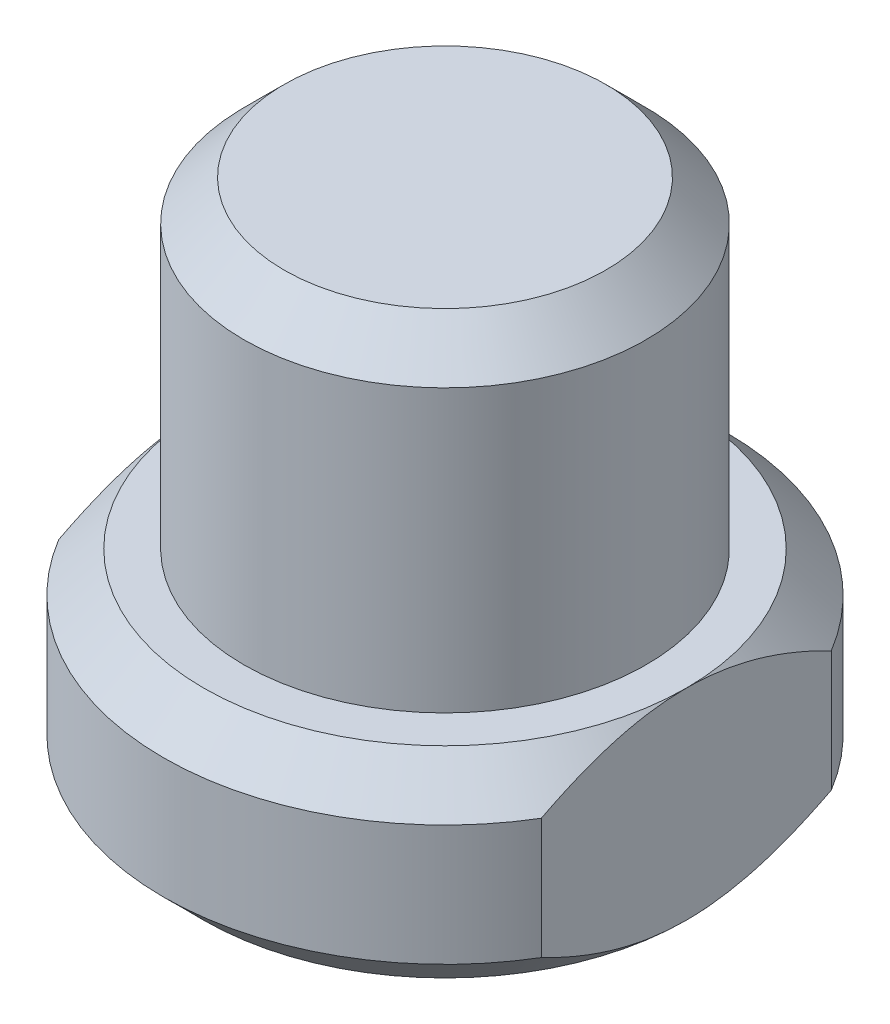
ISO-10303-21;
HEADER;
FILE_DESCRIPTION(('STEP AP214'),'2;1');
FILE_NAME('part.step','',(''),(''),'','','');
FILE_SCHEMA(('AUTOMOTIVE_DESIGN { 1 0 10303 214 1 1 1 1 }'));
ENDSEC;
DATA;
#1=APPLICATION_CONTEXT('core data for automotive mechanical design processes');
#2=APPLICATION_PROTOCOL_DEFINITION('international standard','automotive_design',2000,#1);
#3=PRODUCT_CONTEXT('',#1,'mechanical');
#4=PRODUCT('Part','Part','',(#3));
#5=PRODUCT_RELATED_PRODUCT_CATEGORY('part','',(#4));
#6=PRODUCT_DEFINITION_FORMATION('','',#4);
#7=PRODUCT_DEFINITION_CONTEXT('part definition',#1,'design');
#8=PRODUCT_DEFINITION('design','',#6,#7);
#9=PRODUCT_DEFINITION_SHAPE('','',#8);
#10=(LENGTH_UNIT() NAMED_UNIT(*) SI_UNIT(.MILLI.,.METRE.));
#11=(NAMED_UNIT(*) PLANE_ANGLE_UNIT() SI_UNIT($,.RADIAN.));
#12=(NAMED_UNIT(*) SI_UNIT($,.STERADIAN.) SOLID_ANGLE_UNIT());
#13=UNCERTAINTY_MEASURE_WITH_UNIT(LENGTH_MEASURE(1.E-05),#10,'distance_accuracy_value','');
#14=(GEOMETRIC_REPRESENTATION_CONTEXT(3) GLOBAL_UNCERTAINTY_ASSIGNED_CONTEXT((#13)) GLOBAL_UNIT_ASSIGNED_CONTEXT((#10,
#11,#12)) REPRESENTATION_CONTEXT('',''));
#15=CARTESIAN_POINT('',(0.,0.,0.));
#16=DIRECTION('',(0.,0.,1.));
#17=DIRECTION('',(1.,0.,0.));
#18=AXIS2_PLACEMENT_3D('',#15,#16,#17);
#19=CARTESIAN_POINT('',(0.,0.,0.));
#20=DIRECTION('',(0.,1.,0.));
#21=DIRECTION('',(0.,0.,1.));
#22=AXIS2_PLACEMENT_3D('',#19,#20,#21);
#23=CYLINDRICAL_SURFACE('',#22,7.);
#24=CARTESIAN_POINT('',(0.,1.00000000000033,0.));
#25=DIRECTION('',(0.,1.,0.));
#26=DIRECTION('',(0.,0.,1.));
#27=AXIS2_PLACEMENT_3D('',#24,#25,#26);
#28=CIRCLE('',#27,7.);
#29=CARTESIAN_POINT('',(6.00000000000001,1.00000000000033,-3.605551275464));
#30=VERTEX_POINT('',#29);
#31=CARTESIAN_POINT('',(-6.00000000000001,1.00000000000033,-3.60555127546402));
#32=VERTEX_POINT('',#31);
#33=EDGE_CURVE('E160',#30,#32,#28,.T.);
#34=ORIENTED_EDGE('',*,*,#33,.T.);
#35=DIRECTION('',(0.,1.,0.));
#36=VECTOR('',#35,1.);
#37=CARTESIAN_POINT('',(-6.00000000000001,0.,-3.60555127546402));
#38=LINE('',#37,#36);
#39=CARTESIAN_POINT('',(-6.00000000000001,3.99999999999956,-3.60555127546402));
#40=VERTEX_POINT('',#39);
#41=EDGE_CURVE('E64',#32,#40,#38,.T.);
#42=ORIENTED_EDGE('',*,*,#41,.T.);
#43=CARTESIAN_POINT('',(0.,3.99999999999956,0.));
#44=DIRECTION('',(0.,1.,0.));
#45=DIRECTION('',(0.,0.,1.));
#46=AXIS2_PLACEMENT_3D('',#43,#44,#45);
#47=CIRCLE('',#46,7.);
#48=CARTESIAN_POINT('',(6.00000000000001,3.99999999999956,-3.60555127546403));
#49=VERTEX_POINT('',#48);
#50=EDGE_CURVE('E119',#49,#40,#47,.T.);
#51=ORIENTED_EDGE('',*,*,#50,.F.);
#52=DIRECTION('',(0.,1.,0.));
#53=VECTOR('',#52,1.);
#54=CARTESIAN_POINT('',(6.00000000000001,0.,-3.605551275464));
#55=LINE('',#54,#53);
#56=EDGE_CURVE('E120',#49,#30,#55,.F.);
#57=ORIENTED_EDGE('',*,*,#56,.T.);
#58=EDGE_LOOP('',(#34,#42,#51,#57));
#59=FACE_BOUND('',#58,.T.);
#60=ADVANCED_FACE('F44',(#59),#23,.T.);
#61=CARTESIAN_POINT('',(0.,3.99999999999956,0.));
#62=DIRECTION('',(0.,-1.,0.));
#63=DIRECTION('',(0.,0.,-1.));
#64=AXIS2_PLACEMENT_3D('',#61,#62,#63);
#65=CONICAL_SURFACE('',#64,7.,0.785398163397449);
#66=ORIENTED_EDGE('',*,*,#50,.T.);
#67=CARTESIAN_POINT('',(-6.00000000000001,-2.02979677514836,-11.5661404107707));
#68=CARTESIAN_POINT('',(-6.00000000000001,-1.79146881079267,-11.2976097905496));
#69=CARTESIAN_POINT('',(-6.00000000000001,-1.55408028847918,-11.028237253114));
#70=CARTESIAN_POINT('',(-6.00000000000001,-1.0816851461887,-10.4873603134305));
#71=CARTESIAN_POINT('',(-6.00000000000001,-0.846678793290499,-10.2158556780665));
#72=CARTESIAN_POINT('',(-6.00000000000001,-0.378542744139718,-9.669086248888));
#73=CARTESIAN_POINT('',(-6.00000000000001,-0.145426430687708,-9.39380997399726));
#74=CARTESIAN_POINT('',(-6.00000000000001,0.317065428672959,-8.84015130816264));
#75=CARTESIAN_POINT('',(-6.00000000000001,0.54644116299968,-8.56176907486716));
#76=CARTESIAN_POINT('',(-6.00000000000001,1.01436311140784,-7.98395030269193));
#77=CARTESIAN_POINT('',(-6.00000000000001,1.25260896674657,-7.68426961361499));
#78=CARTESIAN_POINT('',(-6.00000000000001,1.72203804498399,-7.07933619039574));
#79=CARTESIAN_POINT('',(-6.00000000000001,1.95322017653144,-6.77408260675885));
#80=CARTESIAN_POINT('',(-6.00000000000001,2.40552041325527,-6.15704391578297));
#81=CARTESIAN_POINT('',(-6.00000000000001,2.62665710380914,-5.84527257060795));
#82=CARTESIAN_POINT('',(-6.00000000000001,2.94817866705449,-5.37077710084772));
#83=CARTESIAN_POINT('',(-6.00000000000001,3.05364222446894,-5.21149335809911));
#84=CARTESIAN_POINT('',(-6.00000000000001,3.26049287379129,-4.89030636823462));
#85=CARTESIAN_POINT('',(-6.,3.3618802875576,-4.72840332936365));
#86=CARTESIAN_POINT('',(-6.00000000000001,3.52899645380357,-4.45240542180068));
#87=CARTESIAN_POINT('',(-6.00000000000001,3.59601398214699,-4.33909155098068));
#88=CARTESIAN_POINT('',(-6.00000000000001,3.72737764928734,-4.11092816525281));
#89=CARTESIAN_POINT('',(-6.00000000000001,3.79172378021098,-3.99607864582031));
#90=CARTESIAN_POINT('',(-6.00000000000001,3.98023784286186,-3.64895878647408));
#91=CARTESIAN_POINT('',(-6.00000000000001,4.09984954803733,-3.4141691477967));
#92=CARTESIAN_POINT('',(-6.00000000000001,4.32206684441624,-2.93912591263695));
#93=CARTESIAN_POINT('',(-6.00000000000001,4.42481339317554,-2.6989389463608));
#94=CARTESIAN_POINT('',(-6.00000000000001,4.60966523657402,-2.21071934903159));
#95=CARTESIAN_POINT('',(-6.00000000000001,4.69178312635193,-1.96269160995187));
#96=CARTESIAN_POINT('',(-6.00000000000001,4.80860857580128,-1.53669838829372));
#97=CARTESIAN_POINT('',(-6.00000000000001,4.85013138960785,-1.3606052930844));
#98=CARTESIAN_POINT('',(-6.00000000000001,4.91880051242658,-1.00562099164745));
#99=CARTESIAN_POINT('',(-6.00000000000001,4.94594934997519,-0.826730283253964));
#100=CARTESIAN_POINT('',(-6.00000000000001,4.98442565295902,-0.467815198481911));
#101=CARTESIAN_POINT('',(-6.00000000000001,4.99580385136223,-0.287796337501631));
#102=CARTESIAN_POINT('',(-6.00000000000001,5.00226570099365,0.0725419067335196));
#103=CARTESIAN_POINT('',(-6.00000000000001,4.99734912860882,0.25286129407857));
#104=CARTESIAN_POINT('',(-6.00000000000001,4.97157394731632,0.611322010479733));
#105=CARTESIAN_POINT('',(-6.00000000000001,4.95080478624151,0.789469882026787));
#106=CARTESIAN_POINT('',(-6.00000000000001,4.8945211690532,1.14342979147521));
#107=CARTESIAN_POINT('',(-6.00000000000001,4.85900314884088,1.3192412541725));
#108=CARTESIAN_POINT('',(-6.00000000000001,4.77438636740441,1.66958106357355));
#109=CARTESIAN_POINT('',(-6.00000000000001,4.72514199578012,1.84407381326022));
#110=CARTESIAN_POINT('',(-6.00000000000001,4.61515026533972,2.18931186925035));
#111=CARTESIAN_POINT('',(-6.00000000000001,4.55440512044053,2.36005788975738));
#112=CARTESIAN_POINT('',(-6.00000000000001,4.39892342784069,2.76039026044567));
#113=CARTESIAN_POINT('',(-6.00000000000001,4.29993482554905,2.98831860725602));
#114=CARTESIAN_POINT('',(-6.00000000000001,4.08786273758492,3.43757084246485));
#115=CARTESIAN_POINT('',(-6.00000000000001,3.97477122653467,3.65889088075212));
#116=CARTESIAN_POINT('',(-6.00000000000001,3.73730564329471,4.09641361162926));
#117=CARTESIAN_POINT('',(-6.00000000000001,3.61289111438914,4.31259417219535));
#118=CARTESIAN_POINT('',(-6.00000000000001,3.35562605089439,4.73977989309806));
#119=CARTESIAN_POINT('',(-6.00000000000001,3.22277722815056,4.95078609166065));
#120=CARTESIAN_POINT('',(-6.00000000000001,2.9573595332018,5.35785781684801));
#121=CARTESIAN_POINT('',(-6.00000000000001,2.82511846854011,5.55413819422643));
#122=CARTESIAN_POINT('',(-6.00000000000001,2.55582573120988,5.94338396040382));
#123=CARTESIAN_POINT('',(-6.00000000000001,2.41877366800638,6.13634907818258));
#124=CARTESIAN_POINT('',(-6.00000000000001,2.14202520896178,6.51773076015835));
#125=CARTESIAN_POINT('',(-6.00000000000001,2.00236350909527,6.70617258784602));
#126=CARTESIAN_POINT('',(-6.00000000000001,1.71990341155048,7.0806155317909));
#127=CARTESIAN_POINT('',(-6.00000000000001,1.57710584778785,7.26661727641308));
#128=CARTESIAN_POINT('',(-6.00000000000001,1.43304522414578,7.45161886325634));
#129=B_SPLINE_CURVE_WITH_KNOTS('',3,(#67,#68,#69,#70,#71,#72,#73,#74,#75,#76,#77,#78,#79,#80,
#81,#82,#83,#84,#85,#86,#87,#88,#89,#90,#91,#92,#93,#94,#95,#96,#97,#98,#99,#100,#101,#102,#103,
#104,#105,#106,#107,#108,#109,#110,#111,#112,#113,#114,#115,#116,#117,#118,#119,#120,#121,#122,
#123,#124,#125,#126,#127,#128),.UNSPECIFIED.,.F.,.F.,(4,2,2,2,2,2,2,2,2,2,2,2,2,2,2,2,2,2,2,2,2,
2,2,2,2,2,2,2,2,2,4),(0.,1.07712344820326,2.15436635214866,3.23650502013409,4.31858900989687,
5.46703820996629,6.6156639582858,7.76206998619451,8.33512399248531,8.90813266034527,
9.30304494578501,9.69795839504988,10.4879681133811,11.2709957035387,12.0535440359906,
12.5958011820691,13.1379629075858,13.6783764592678,14.2187974270726,14.7561914211106,
15.2937153533988,15.8371738864698,16.3805279090948,17.1253550100298,17.8706079119149,
18.6186367660037,19.3665142806594,20.0764452484526,20.7864339790826,21.4900612113484,
22.1935035422391),.UNSPECIFIED.);
#130=CARTESIAN_POINT('',(-6.00000000000001,4.99999999999989,0.));
#131=VERTEX_POINT('',#130);
#132=EDGE_CURVE('E105',#40,#131,#129,.T.);
#133=ORIENTED_EDGE('',*,*,#132,.T.);
#134=CARTESIAN_POINT('',(0.,4.99999999999989,0.));
#135=DIRECTION('',(0.,1.,0.));
#136=DIRECTION('',(0.,0.,1.));
#137=AXIS2_PLACEMENT_3D('',#134,#135,#136);
#138=CIRCLE('',#137,6.);
#139=CARTESIAN_POINT('',(6.00000000000001,4.99999999999989,0.));
#140=VERTEX_POINT('',#139);
#141=EDGE_CURVE('E117',#140,#131,#138,.T.);
#142=ORIENTED_EDGE('',*,*,#141,.F.);
#143=CARTESIAN_POINT('',(6.00000000000001,-2.02979677514836,-11.5661404107707));
#144=CARTESIAN_POINT('',(6.00000000000001,-1.79146881079267,-11.2976097905496));
#145=CARTESIAN_POINT('',(6.00000000000001,-1.55408028847917,-11.028237253114));
#146=CARTESIAN_POINT('',(6.00000000000001,-1.08168514618869,-10.4873603134305));
#147=CARTESIAN_POINT('',(6.00000000000001,-0.846678793290494,-10.2158556780665));
#148=CARTESIAN_POINT('',(6.00000000000001,-0.378542744139714,-9.66908624888799));
#149=CARTESIAN_POINT('',(6.,-0.145426430687703,-9.39380997399725));
#150=CARTESIAN_POINT('',(6.,0.317065428672965,-8.84015130816264));
#151=CARTESIAN_POINT('',(6.,0.546441162999685,-8.56176907486716));
#152=CARTESIAN_POINT('',(6.,1.01436311140785,-7.98395030269192));
#153=CARTESIAN_POINT('',(6.,1.25260896674658,-7.68426961361498));
#154=CARTESIAN_POINT('',(6.,1.722038044984,-7.07933619039573));
#155=CARTESIAN_POINT('',(6.,1.95322017653145,-6.77408260675884));
#156=CARTESIAN_POINT('',(6.,2.40552041325527,-6.15704391578296));
#157=CARTESIAN_POINT('',(6.,2.62665710380914,-5.84527257060793));
#158=CARTESIAN_POINT('',(6.,2.9481786670545,-5.37077710084771));
#159=CARTESIAN_POINT('',(6.,3.05364222446895,-5.21149335809909));
#160=CARTESIAN_POINT('',(6.,3.2604928737913,-4.8903063682346));
#161=CARTESIAN_POINT('',(6.00000000000001,3.3618802875576,-4.72840332936363));
#162=CARTESIAN_POINT('',(6.00000000000001,3.52899645380357,-4.45240542180065));
#163=CARTESIAN_POINT('',(6.,3.596013982147,-4.33909155098066));
#164=CARTESIAN_POINT('',(6.,3.72737764928736,-4.1109281652528));
#165=CARTESIAN_POINT('',(6.,3.79172378021099,-3.99607864582029));
#166=CARTESIAN_POINT('',(6.,3.98023784286187,-3.64895878647407));
#167=CARTESIAN_POINT('',(6.,4.09984954803734,-3.41416914779669));
#168=CARTESIAN_POINT('',(6.,4.32206684441625,-2.93912591263694));
#169=CARTESIAN_POINT('',(6.,4.42481339317554,-2.69893894636079));
#170=CARTESIAN_POINT('',(6.,4.60966523657402,-2.21071934903158));
#171=CARTESIAN_POINT('',(6.00000000000001,4.69178312635193,-1.96269160995187));
#172=CARTESIAN_POINT('',(6.,4.80860857580128,-1.53669838829372));
#173=CARTESIAN_POINT('',(6.,4.85013138960785,-1.3606052930844));
#174=CARTESIAN_POINT('',(6.,4.91880051242659,-1.00562099164745));
#175=CARTESIAN_POINT('',(6.,4.94594934997519,-0.826730283253965));
#176=CARTESIAN_POINT('',(6.,4.98442565295903,-0.467815198481911));
#177=CARTESIAN_POINT('',(6.,4.99580385136224,-0.287796337501631));
#178=CARTESIAN_POINT('',(6.,5.00226570099366,0.0725419067335198));
#179=CARTESIAN_POINT('',(6.00000000000001,4.99734912860882,0.252861294078571));
#180=CARTESIAN_POINT('',(6.00000000000001,4.97157394731632,0.611322010479731));
#181=CARTESIAN_POINT('',(6.,4.95080478624151,0.789469882026785));
#182=CARTESIAN_POINT('',(6.,4.89452116905321,1.14342979147521));
#183=CARTESIAN_POINT('',(6.,4.85900314884089,1.3192412541725));
#184=CARTESIAN_POINT('',(6.,4.77438636740442,1.66958106357355));
#185=CARTESIAN_POINT('',(6.,4.72514199578012,1.84407381326022));
#186=CARTESIAN_POINT('',(6.,4.61515026533972,2.18931186925035));
#187=CARTESIAN_POINT('',(6.00000000000001,4.55440512044053,2.36005788975737));
#188=CARTESIAN_POINT('',(6.00000000000001,4.39892342784069,2.76039026044566));
#189=CARTESIAN_POINT('',(6.,4.29993482554906,2.98831860725601));
#190=CARTESIAN_POINT('',(6.,4.08786273758493,3.43757084246485));
#191=CARTESIAN_POINT('',(6.,3.97477122653467,3.65889088075212));
#192=CARTESIAN_POINT('',(6.,3.73730564329471,4.09641361162926));
#193=CARTESIAN_POINT('',(6.,3.61289111438914,4.31259417219535));
#194=CARTESIAN_POINT('',(6.,3.35562605089439,4.73977989309806));
#195=CARTESIAN_POINT('',(6.,3.22277722815056,4.95078609166065));
#196=CARTESIAN_POINT('',(6.,2.9573595332018,5.35785781684801));
#197=CARTESIAN_POINT('',(6.,2.82511846854012,5.55413819422644));
#198=CARTESIAN_POINT('',(6.,2.55582573120988,5.94338396040382));
#199=CARTESIAN_POINT('',(6.,2.41877366800638,6.13634907818258));
#200=CARTESIAN_POINT('',(6.,2.14202520896178,6.51773076015835));
#201=CARTESIAN_POINT('',(6.,2.00236350909528,6.70617258784602));
#202=CARTESIAN_POINT('',(6.,1.71990341155049,7.0806155317909));
#203=CARTESIAN_POINT('',(6.,1.57710584778785,7.26661727641308));
#204=CARTESIAN_POINT('',(6.00000000000001,1.43304522414578,7.45161886325634));
#205=B_SPLINE_CURVE_WITH_KNOTS('',3,(#143,#144,#145,#146,#147,#148,#149,#150,#151,#152,#153,
#154,#155,#156,#157,#158,#159,#160,#161,#162,#163,#164,#165,#166,#167,#168,#169,#170,#171,#172,
#173,#174,#175,#176,#177,#178,#179,#180,#181,#182,#183,#184,#185,#186,#187,#188,#189,#190,#191,
#192,#193,#194,#195,#196,#197,#198,#199,#200,#201,#202,#203,#204),.UNSPECIFIED.,.F.,.F.,(4,2,2,
2,2,2,2,2,2,2,2,2,2,2,2,2,2,2,2,2,2,2,2,2,2,2,2,2,2,2,4),(0.,1.07712344820326,2.15436635214867,
3.23650502013409,4.31858900989687,5.4670382099663,6.61566395828581,7.76206998619452,
8.33512399248533,8.90813266034529,9.30304494578503,9.6979583950499,10.4879681133811,
11.2709957035387,12.0535440359906,12.5958011820691,13.1379629075858,13.6783764592678,
14.2187974270726,14.7561914211106,15.2937153533988,15.8371738864698,16.3805279090948,
17.1253550100298,17.8706079119149,18.6186367660037,19.3665142806594,20.0764452484526,
20.7864339790826,21.4900612113484,22.1935035422391),.UNSPECIFIED.);
#206=EDGE_CURVE('E152',#140,#49,#205,.F.);
#207=ORIENTED_EDGE('',*,*,#206,.T.);
#208=EDGE_LOOP('',(#66,#133,#142,#207));
#209=FACE_BOUND('',#208,.T.);
#210=ADVANCED_FACE('F114',(#209),#65,.T.);
#211=CARTESIAN_POINT('',(0.,0.,0.));
#212=DIRECTION('',(0.,1.,0.));
#213=DIRECTION('',(0.,0.,1.));
#214=AXIS2_PLACEMENT_3D('',#211,#212,#213);
#215=CONICAL_SURFACE('',#214,5.99999999999998,0.78539816339746);
#216=CARTESIAN_POINT('',(-6.00000000000001,1.00000000000033,3.60555127546396));
#217=VERTEX_POINT('',#216);
#218=CARTESIAN_POINT('',(6.00000000000001,1.00000000000033,3.60555127546399));
#219=VERTEX_POINT('',#218);
#220=EDGE_CURVE('E72',#217,#219,#28,.T.);
#221=ORIENTED_EDGE('',*,*,#220,.F.);
#222=CARTESIAN_POINT('',(-6.00000000000001,7.02979677514826,-11.5661404107708));
#223=CARTESIAN_POINT('',(-6.00000000000001,6.79146881079234,-11.2976097905497));
#224=CARTESIAN_POINT('',(-6.00000000000001,6.55408028847871,-11.0282372531141));
#225=CARTESIAN_POINT('',(-6.00000000000001,6.08168514618804,-10.4873603134305));
#226=CARTESIAN_POINT('',(-6.00000000000001,5.84667879328979,-10.2158556780663));
#227=CARTESIAN_POINT('',(-6.00000000000001,5.37854274413892,-9.66908624888768));
#228=CARTESIAN_POINT('',(-6.00000000000001,5.14542643068686,-9.39380997399689));
#229=CARTESIAN_POINT('',(-6.00000000000001,4.68293457132612,-8.84015130816216));
#230=CARTESIAN_POINT('',(-6.00000000000001,4.45355883699936,-8.56176907486662));
#231=CARTESIAN_POINT('',(-6.00000000000001,3.98563688859123,-7.9839503026914));
#232=CARTESIAN_POINT('',(-6.00000000000001,3.74739103325257,-7.68426961361453));
#233=CARTESIAN_POINT('',(-6.00000000000001,3.27796195501528,-7.07933619039544));
#234=CARTESIAN_POINT('',(-6.00000000000001,3.0467798234679,-6.77408260675864));
#235=CARTESIAN_POINT('',(-6.00000000000001,2.59447958674421,-6.15704391578288));
#236=CARTESIAN_POINT('',(-6.00000000000001,2.37334289619043,-5.84527257060788));
#237=CARTESIAN_POINT('',(-6.00000000000001,2.05182133294505,-5.37077710084779));
#238=CARTESIAN_POINT('',(-6.00000000000001,1.94635777553057,-5.21149335809923));
#239=CARTESIAN_POINT('',(-6.00000000000001,1.73950712620841,-4.8903063682347));
#240=CARTESIAN_POINT('',(-6.,1.63811971244233,-4.72840332936362));
#241=CARTESIAN_POINT('',(-6.00000000000001,1.4710035461963,-4.45240542180072));
#242=CARTESIAN_POINT('',(-6.00000000000001,1.40398601785272,-4.33909155098082));
#243=CARTESIAN_POINT('',(-6.00000000000001,1.27262235071226,-4.11092816525304));
#244=CARTESIAN_POINT('',(-6.00000000000001,1.20827621978866,-3.99607864582053));
#245=CARTESIAN_POINT('',(-6.00000000000001,1.0197621571379,-3.64895878647431));
#246=CARTESIAN_POINT('',(-6.00000000000001,0.900150451962495,-3.41416914779698));
#247=CARTESIAN_POINT('',(-6.00000000000001,0.677933155583385,-2.93912591263736));
#248=CARTESIAN_POINT('',(-6.00000000000001,0.575186606823834,-2.6989389463613));
#249=CARTESIAN_POINT('',(-6.00000000000001,0.390334763426047,-2.21071934903187));
#250=CARTESIAN_POINT('',(-6.00000000000001,0.30821687364909,-1.96269160995183));
#251=CARTESIAN_POINT('',(-6.00000000000001,0.191391424199329,-1.53669838829366));
#252=CARTESIAN_POINT('',(-6.00000000000001,0.149868610392018,-1.36060529308447));
#253=CARTESIAN_POINT('',(-6.00000000000001,0.0811994875727461,-1.00562099164758));
#254=CARTESIAN_POINT('',(-6.00000000000001,0.0540506500243481,-0.826730283254024));
#255=CARTESIAN_POINT('',(-6.00000000000001,0.0155743470406083,-0.467815198481907));
#256=CARTESIAN_POINT('',(-6.00000000000001,0.00419614863728724,-0.287796337501633));
#257=CARTESIAN_POINT('',(-6.00000000000001,-0.0022657009940103,0.0725419067335352));
#258=CARTESIAN_POINT('',(-6.00000000000001,0.00265087139106523,0.252861294078609));
#259=CARTESIAN_POINT('',(-6.00000000000001,0.0284260526835789,0.611322010479821));
#260=CARTESIAN_POINT('',(-6.00000000000001,0.0491952137581669,0.789469882026902));
#261=CARTESIAN_POINT('',(-6.00000000000001,0.10547883094632,1.14342979147534));
#262=CARTESIAN_POINT('',(-6.00000000000001,0.140996851158716,1.31924125417261));
#263=CARTESIAN_POINT('',(-6.00000000000001,0.225613632595204,1.66958106357367));
#264=CARTESIAN_POINT('',(-6.00000000000001,0.274858004219446,1.84407381326037));
#265=CARTESIAN_POINT('',(-6.00000000000001,0.384849734659961,2.18931186925049));
#266=CARTESIAN_POINT('',(-6.00000000000001,0.445594879559324,2.36005788975748));
#267=CARTESIAN_POINT('',(-6.00000000000001,0.601076572159278,2.76039026044583));
#268=CARTESIAN_POINT('',(-6.00000000000001,0.700065174450738,2.98831860725633));
#269=CARTESIAN_POINT('',(-6.00000000000001,0.912137262414791,3.43757084246534));
#270=CARTESIAN_POINT('',(-6.00000000000001,1.02522877346513,3.65889088075263));
#271=CARTESIAN_POINT('',(-6.00000000000001,1.2626943567052,4.09641361162985));
#272=CARTESIAN_POINT('',(-6.00000000000001,1.38710888561078,4.31259417219597));
#273=CARTESIAN_POINT('',(-6.00000000000001,1.64437394910559,4.73977989309875));
#274=CARTESIAN_POINT('',(-6.00000000000001,1.77722277184945,4.95078609166138));
#275=CARTESIAN_POINT('',(-6.00000000000001,2.04264046679823,5.35785781684874));
#276=CARTESIAN_POINT('',(-6.00000000000001,2.1748815314599,5.55413819422713));
#277=CARTESIAN_POINT('',(-6.00000000000001,2.44417426879009,5.94338396040444));
#278=CARTESIAN_POINT('',(-6.00000000000001,2.58122633199357,6.13634907818317));
#279=CARTESIAN_POINT('',(-6.00000000000001,2.85797479103814,6.51773076015888));
#280=CARTESIAN_POINT('',(-6.00000000000001,2.99763649090464,6.70617258784654));
#281=CARTESIAN_POINT('',(-6.00000000000001,3.28009658844941,7.0806155317914));
#282=CARTESIAN_POINT('',(-6.00000000000001,3.42289415221204,7.26661727641357));
#283=CARTESIAN_POINT('',(-6.00000000000001,3.56695477585411,7.45161886325681));
#284=B_SPLINE_CURVE_WITH_KNOTS('',3,(#222,#223,#224,#225,#226,#227,#228,#229,#230,#231,#232,
#233,#234,#235,#236,#237,#238,#239,#240,#241,#242,#243,#244,#245,#246,#247,#248,#249,#250,#251,
#252,#253,#254,#255,#256,#257,#258,#259,#260,#261,#262,#263,#264,#265,#266,#267,#268,#269,#270,
#271,#272,#273,#274,#275,#276,#277,#278,#279,#280,#281,#282,#283),.UNSPECIFIED.,.F.,.F.,(4,2,2,
2,2,2,2,2,2,2,2,2,2,2,2,2,2,2,2,2,2,2,2,2,2,2,2,2,2,2,4),(0.,1.0771234482036,2.15436635214933,
3.23650502013496,4.31858900989795,5.46703820996707,6.61566395828626,7.76206998619475,
8.33512399248546,8.90813266034535,9.30304494578506,9.69795839504989,10.487968113381,
11.2709957035385,12.0535440359905,12.5958011820691,13.1379629075859,13.6783764592679,
14.2187974270728,14.7561914211109,15.293715353399,15.8371738864701,16.3805279090951,
17.1253550100303,17.8706079119157,18.6186367660045,19.3665142806604,20.0764452484535,
20.7864339790833,21.4900612113491,22.1935035422397),.UNSPECIFIED.);
#285=CARTESIAN_POINT('',(-6.00000000000001,-8.88178419700125E-13,0.));
#286=VERTEX_POINT('',#285);
#287=EDGE_CURVE('E12',#217,#286,#284,.F.);
#288=ORIENTED_EDGE('',*,*,#287,.T.);
#289=CARTESIAN_POINT('',(0.,0.,0.));
#290=DIRECTION('',(0.,1.,0.));
#291=DIRECTION('',(0.,0.,1.));
#292=AXIS2_PLACEMENT_3D('',#289,#290,#291);
#293=CIRCLE('',#292,5.99999999999998);
#294=CARTESIAN_POINT('',(6.00000000000001,-8.88178419700125E-13,0.));
#295=VERTEX_POINT('',#294);
#296=EDGE_CURVE('E181',#286,#295,#293,.T.);
#297=ORIENTED_EDGE('',*,*,#296,.T.);
#298=CARTESIAN_POINT('',(6.00000000000001,7.02979677514826,-11.5661404107708));
#299=CARTESIAN_POINT('',(6.00000000000001,6.79146881079234,-11.2976097905497));
#300=CARTESIAN_POINT('',(6.00000000000001,6.55408028847871,-11.0282372531141));
#301=CARTESIAN_POINT('',(6.00000000000001,6.08168514618804,-10.4873603134305));
#302=CARTESIAN_POINT('',(6.,5.84667879328979,-10.2158556780663));
#303=CARTESIAN_POINT('',(6.,5.37854274413891,-9.66908624888767));
#304=CARTESIAN_POINT('',(6.,5.14542643068686,-9.39380997399688));
#305=CARTESIAN_POINT('',(6.,4.68293457132611,-8.84015130816215));
#306=CARTESIAN_POINT('',(6.,4.45355883699935,-8.56176907486661));
#307=CARTESIAN_POINT('',(6.,3.98563688859122,-7.98395030269139));
#308=CARTESIAN_POINT('',(6.,3.74739103325256,-7.68426961361452));
#309=CARTESIAN_POINT('',(6.,3.27796195501527,-7.07933619039543));
#310=CARTESIAN_POINT('',(6.,3.04677982346789,-6.77408260675863));
#311=CARTESIAN_POINT('',(6.,2.5944795867442,-6.15704391578286));
#312=CARTESIAN_POINT('',(6.,2.37334289619042,-5.84527257060787));
#313=CARTESIAN_POINT('',(6.,2.05182133294504,-5.37077710084778));
#314=CARTESIAN_POINT('',(6.,1.94635777553055,-5.21149335809922));
#315=CARTESIAN_POINT('',(6.,1.7395071262084,-4.89030636823467));
#316=CARTESIAN_POINT('',(6.00000000000001,1.63811971244233,-4.72840332936359));
#317=CARTESIAN_POINT('',(6.00000000000001,1.4710035461963,-4.45240542180069));
#318=CARTESIAN_POINT('',(6.,1.40398601785271,-4.3390915509808));
#319=CARTESIAN_POINT('',(6.,1.27262235071224,-4.11092816525302));
#320=CARTESIAN_POINT('',(6.,1.20827621978865,-3.99607864582051));
#321=CARTESIAN_POINT('',(6.,1.01976215713789,-3.64895878647429));
#322=CARTESIAN_POINT('',(6.,0.900150451962483,-3.41416914779696));
#323=CARTESIAN_POINT('',(6.,0.677933155583372,-2.93912591263734));
#324=CARTESIAN_POINT('',(6.,0.575186606823821,-2.69893894636129));
#325=CARTESIAN_POINT('',(6.,0.390334763426041,-2.21071934903185));
#326=CARTESIAN_POINT('',(6.00000000000001,0.308216873649092,-1.96269160995181));
#327=CARTESIAN_POINT('',(6.,0.191391424199328,-1.53669838829364));
#328=CARTESIAN_POINT('',(6.,0.149868610392012,-1.36060529308445));
#329=CARTESIAN_POINT('',(6.,0.0811994875727371,-1.00562099164756));
#330=CARTESIAN_POINT('',(6.,0.0540506500243413,-0.826730283254005));
#331=CARTESIAN_POINT('',(6.,0.0155743470406027,-0.467815198481888));
#332=CARTESIAN_POINT('',(6.,0.00419614863728051,-0.287796337501614));
#333=CARTESIAN_POINT('',(6.,-0.00226570099401466,0.0725419067335546));
#334=CARTESIAN_POINT('',(6.00000000000001,0.00265087139106437,0.252861294078629));
#335=CARTESIAN_POINT('',(6.00000000000001,0.0284260526835797,0.611322010479842));
#336=CARTESIAN_POINT('',(6.,0.0491952137581658,0.789469882026923));
#337=CARTESIAN_POINT('',(6.,0.105478830946318,1.14342979147536));
#338=CARTESIAN_POINT('',(6.,0.140996851158715,1.31924125417263));
#339=CARTESIAN_POINT('',(6.,0.225613632595205,1.6695810635737));
#340=CARTESIAN_POINT('',(6.,0.274858004219448,1.84407381326039));
#341=CARTESIAN_POINT('',(6.,0.384849734659962,2.18931186925051));
#342=CARTESIAN_POINT('',(6.00000000000001,0.445594879559324,2.3600578897575));
#343=CARTESIAN_POINT('',(6.00000000000001,0.601076572159277,2.76039026044585));
#344=CARTESIAN_POINT('',(6.,0.700065174450739,2.98831860725634));
#345=CARTESIAN_POINT('',(6.,0.912137262414792,3.43757084246535));
#346=CARTESIAN_POINT('',(6.,1.02522877346514,3.65889088075264));
#347=CARTESIAN_POINT('',(6.,1.2626943567052,4.09641361162986));
#348=CARTESIAN_POINT('',(6.,1.38710888561078,4.31259417219598));
#349=CARTESIAN_POINT('',(6.,1.64437394910559,4.73977989309876));
#350=CARTESIAN_POINT('',(6.,1.77722277184945,4.95078609166138));
#351=CARTESIAN_POINT('',(6.,2.04264046679823,5.35785781684874));
#352=CARTESIAN_POINT('',(6.,2.17488153145989,5.55413819422713));
#353=CARTESIAN_POINT('',(6.,2.44417426879009,5.94338396040444));
#354=CARTESIAN_POINT('',(6.,2.58122633199356,6.13634907818317));
#355=CARTESIAN_POINT('',(6.,2.85797479103813,6.51773076015888));
#356=CARTESIAN_POINT('',(6.,2.99763649090463,6.70617258784654));
#357=CARTESIAN_POINT('',(6.,3.28009658844941,7.0806155317914));
#358=CARTESIAN_POINT('',(6.,3.42289415221204,7.26661727641356));
#359=CARTESIAN_POINT('',(6.00000000000001,3.56695477585411,7.4516188632568));
#360=B_SPLINE_CURVE_WITH_KNOTS('',3,(#298,#299,#300,#301,#302,#303,#304,#305,#306,#307,#308,
#309,#310,#311,#312,#313,#314,#315,#316,#317,#318,#319,#320,#321,#322,#323,#324,#325,#326,#327,
#328,#329,#330,#331,#332,#333,#334,#335,#336,#337,#338,#339,#340,#341,#342,#343,#344,#345,#346,
#347,#348,#349,#350,#351,#352,#353,#354,#355,#356,#357,#358,#359),.UNSPECIFIED.,.F.,.F.,(4,2,2,
2,2,2,2,2,2,2,2,2,2,2,2,2,2,2,2,2,2,2,2,2,2,2,2,2,2,2,4),(0.,1.0771234482036,2.15436635214934,
3.23650502013497,4.31858900989796,5.46703820996708,6.61566395828627,7.76206998619477,
8.33512399248548,8.90813266034537,9.30304494578509,9.69795839504992,10.487968113381,
11.2709957035385,12.0535440359906,12.5958011820692,13.137962907586,13.6783764592679,
14.2187974270729,14.7561914211109,15.2937153533991,15.8371738864701,16.3805279090951,
17.1253550100304,17.8706079119157,18.6186367660045,19.3665142806605,20.0764452484535,
20.7864339790833,21.4900612113491,22.1935035422397),.UNSPECIFIED.);
#361=EDGE_CURVE('E135',#295,#219,#360,.T.);
#362=ORIENTED_EDGE('',*,*,#361,.T.);
#363=EDGE_LOOP('',(#221,#288,#297,#362));
#364=FACE_BOUND('',#363,.T.);
#365=ADVANCED_FACE('F179',(#364),#215,.T.);
#366=CARTESIAN_POINT('',(-6.00000000000001,3.99999999999956,3.60555127546396));
#367=VERTEX_POINT('',#366);
#368=CARTESIAN_POINT('',(6.00000000000001,3.99999999999956,3.60555127546396));
#369=VERTEX_POINT('',#368);
#370=EDGE_CURVE('E131',#367,#369,#47,.T.);
#371=ORIENTED_EDGE('',*,*,#370,.F.);
#372=DIRECTION('',(0.,1.,0.));
#373=VECTOR('',#372,1.);
#374=CARTESIAN_POINT('',(-6.00000000000001,0.,3.60555127546396));
#375=LINE('',#374,#373);
#376=EDGE_CURVE('E106',#367,#217,#375,.F.);
#377=ORIENTED_EDGE('',*,*,#376,.T.);
#378=ORIENTED_EDGE('',*,*,#220,.T.);
#379=DIRECTION('',(0.,1.,0.));
#380=VECTOR('',#379,1.);
#381=CARTESIAN_POINT('',(6.00000000000001,0.,3.605551275464));
#382=LINE('',#381,#380);
#383=EDGE_CURVE('E158',#219,#369,#382,.T.);
#384=ORIENTED_EDGE('',*,*,#383,.T.);
#385=EDGE_LOOP('',(#371,#377,#378,#384));
#386=FACE_BOUND('',#385,.T.);
#387=ADVANCED_FACE('F46',(#386),#23,.T.);
#388=EDGE_CURVE('E122',#131,#140,#138,.T.);
#389=ORIENTED_EDGE('',*,*,#388,.F.);
#390=EDGE_CURVE('E102',#131,#367,#129,.T.);
#391=ORIENTED_EDGE('',*,*,#390,.T.);
#392=ORIENTED_EDGE('',*,*,#370,.T.);
#393=EDGE_CURVE('E125',#369,#140,#205,.F.);
#394=ORIENTED_EDGE('',*,*,#393,.T.);
#395=EDGE_LOOP('',(#389,#391,#392,#394));
#396=FACE_BOUND('',#395,.T.);
#397=ADVANCED_FACE('F123',(#396),#65,.T.);
#398=CARTESIAN_POINT('',(0.,4.99999999999989,-6.));
#399=DIRECTION('',(0.,-1.,0.));
#400=DIRECTION('',(0.,0.,-1.));
#401=AXIS2_PLACEMENT_3D('',#398,#399,#400);
#402=PLANE('',#401);
#403=CARTESIAN_POINT('',(0.,4.99999999999989,0.));
#404=DIRECTION('',(0.,1.,0.));
#405=DIRECTION('',(0.,0.,1.));
#406=AXIS2_PLACEMENT_3D('',#403,#404,#405);
#407=CIRCLE('',#406,5.);
#408=CARTESIAN_POINT('',(0.,4.99999999999989,5.));
#409=VERTEX_POINT('',#408);
#410=EDGE_CURVE('E128',#409,#409,#407,.T.);
#411=ORIENTED_EDGE('',*,*,#410,.F.);
#412=EDGE_LOOP('',(#411));
#413=FACE_BOUND('',#412,.T.);
#414=ORIENTED_EDGE('',*,*,#141,.T.);
#415=ORIENTED_EDGE('',*,*,#388,.T.);
#416=EDGE_LOOP('',(#414,#415));
#417=FACE_BOUND('',#416,.T.);
#418=ADVANCED_FACE('F130',(#413,#417),#402,.F.);
#419=CARTESIAN_POINT('',(0.,0.,0.));
#420=DIRECTION('',(0.,1.,0.));
#421=DIRECTION('',(0.,0.,1.));
#422=AXIS2_PLACEMENT_3D('',#419,#420,#421);
#423=CYLINDRICAL_SURFACE('',#422,5.);
#424=CARTESIAN_POINT('',(0.,11.9999999999996,0.));
#425=DIRECTION('',(0.,1.,0.));
#426=DIRECTION('',(0.,0.,1.));
#427=AXIS2_PLACEMENT_3D('',#424,#425,#426);
#428=CIRCLE('',#427,5.);
#429=CARTESIAN_POINT('',(0.,11.9999999999996,5.));
#430=VERTEX_POINT('',#429);
#431=EDGE_CURVE('E189',#430,#430,#428,.T.);
#432=ORIENTED_EDGE('',*,*,#431,.F.);
#433=EDGE_LOOP('',(#432));
#434=FACE_BOUND('',#433,.T.);
#435=ORIENTED_EDGE('',*,*,#410,.T.);
#436=EDGE_LOOP('',(#435));
#437=FACE_BOUND('',#436,.T.);
#438=ADVANCED_FACE('F196',(#434,#437),#423,.T.);
#439=CARTESIAN_POINT('',(0.,11.9999999999996,0.));
#440=DIRECTION('',(0.,-1.,0.));
#441=DIRECTION('',(0.,0.,-1.));
#442=AXIS2_PLACEMENT_3D('',#439,#440,#441);
#443=CONICAL_SURFACE('',#442,5.,0.785398163397447);
#444=CARTESIAN_POINT('',(0.,12.9999999999999,0.));
#445=DIRECTION('',(0.,1.,0.));
#446=DIRECTION('',(0.,0.,1.));
#447=AXIS2_PLACEMENT_3D('',#444,#445,#446);
#448=CIRCLE('',#447,4.);
#449=CARTESIAN_POINT('',(0.,12.9999999999999,4.));
#450=VERTEX_POINT('',#449);
#451=EDGE_CURVE('E186',#450,#450,#448,.T.);
#452=ORIENTED_EDGE('',*,*,#451,.F.);
#453=EDGE_LOOP('',(#452));
#454=FACE_BOUND('',#453,.T.);
#455=ORIENTED_EDGE('',*,*,#431,.T.);
#456=EDGE_LOOP('',(#455));
#457=FACE_BOUND('',#456,.T.);
#458=ADVANCED_FACE('F202',(#454,#457),#443,.T.);
#459=CARTESIAN_POINT('',(0.,12.9999999999999,-4.));
#460=DIRECTION('',(0.,-1.,0.));
#461=DIRECTION('',(0.,0.,-1.));
#462=AXIS2_PLACEMENT_3D('',#459,#460,#461);
#463=PLANE('',#462);
#464=ORIENTED_EDGE('',*,*,#451,.T.);
#465=EDGE_LOOP('',(#464));
#466=FACE_BOUND('',#465,.T.);
#467=ADVANCED_FACE('F220',(#466),#463,.F.);
#468=CARTESIAN_POINT('',(0.,0.,0.));
#469=DIRECTION('',(0.,1.,0.));
#470=DIRECTION('',(0.,0.,1.));
#471=AXIS2_PLACEMENT_3D('',#468,#469,#470);
#472=PLANE('',#471);
#473=EDGE_CURVE('E185',#295,#286,#293,.T.);
#474=ORIENTED_EDGE('',*,*,#473,.F.);
#475=ORIENTED_EDGE('',*,*,#296,.F.);
#476=EDGE_LOOP('',(#474,#475));
#477=FACE_BOUND('',#476,.T.);
#478=ADVANCED_FACE('F215',(#477),#472,.F.);
#479=ORIENTED_EDGE('',*,*,#473,.T.);
#480=EDGE_CURVE('E48',#286,#32,#284,.F.);
#481=ORIENTED_EDGE('',*,*,#480,.T.);
#482=ORIENTED_EDGE('',*,*,#33,.F.);
#483=EDGE_CURVE('E141',#30,#295,#360,.T.);
#484=ORIENTED_EDGE('',*,*,#483,.T.);
#485=EDGE_LOOP('',(#479,#481,#482,#484));
#486=FACE_BOUND('',#485,.T.);
#487=ADVANCED_FACE('F142',(#486),#215,.T.);
#488=CARTESIAN_POINT('',(6.00000000000001,-3.99999999999956,-11.5));
#489=DIRECTION('',(-0.999999999999999,0.,0.));
#490=DIRECTION('',(0.,0.,1.));
#491=AXIS2_PLACEMENT_3D('',#488,#489,#490);
#492=PLANE('',#491);
#493=ORIENTED_EDGE('',*,*,#383,.F.);
#494=ORIENTED_EDGE('',*,*,#361,.F.);
#495=ORIENTED_EDGE('',*,*,#483,.F.);
#496=ORIENTED_EDGE('',*,*,#56,.F.);
#497=ORIENTED_EDGE('',*,*,#206,.F.);
#498=ORIENTED_EDGE('',*,*,#393,.F.);
#499=EDGE_LOOP('',(#493,#494,#495,#496,#497,#498));
#500=FACE_BOUND('',#499,.T.);
#501=ADVANCED_FACE('F145',(#500),#492,.F.);
#502=CARTESIAN_POINT('',(-6.00000000000001,-4.00000000000045,-11.5));
#503=DIRECTION('',(0.999999999999999,0.,0.));
#504=DIRECTION('',(0.,0.,-1.));
#505=AXIS2_PLACEMENT_3D('',#502,#503,#504);
#506=PLANE('',#505);
#507=ORIENTED_EDGE('',*,*,#41,.F.);
#508=ORIENTED_EDGE('',*,*,#480,.F.);
#509=ORIENTED_EDGE('',*,*,#287,.F.);
#510=ORIENTED_EDGE('',*,*,#376,.F.);
#511=ORIENTED_EDGE('',*,*,#390,.F.);
#512=ORIENTED_EDGE('',*,*,#132,.F.);
#513=EDGE_LOOP('',(#507,#508,#509,#510,#511,#512));
#514=FACE_BOUND('',#513,.T.);
#515=ADVANCED_FACE('F104',(#514),#506,.F.);
#516=CLOSED_SHELL('',(#60,#210,#365,#387,#397,#418,#438,#458,#467,#478,#487,#501,#515));
#517=MANIFOLD_SOLID_BREP('B2',#516);
#518=ADVANCED_BREP_SHAPE_REPRESENTATION('',(#18,#517),#14);
#519=SHAPE_DEFINITION_REPRESENTATION(#9,#518);
ENDSEC;
END-ISO-10303-21;
